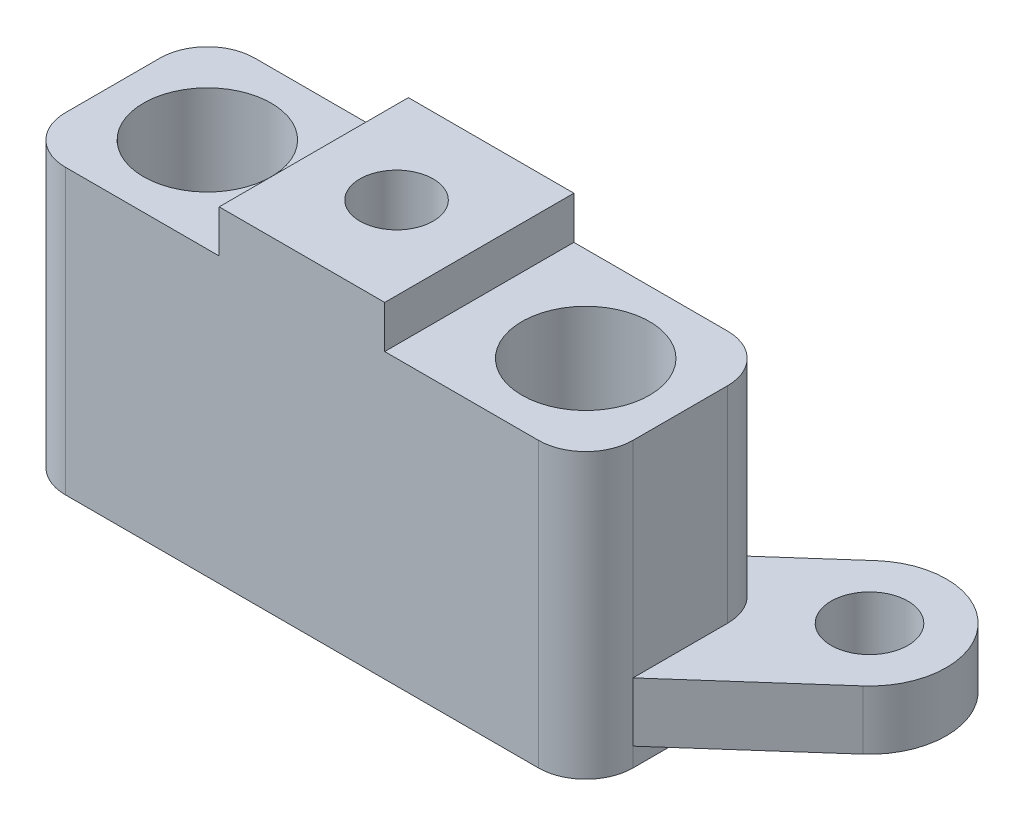
ISO-10303-21;
HEADER;
FILE_DESCRIPTION(('STEP AP214'),'2;1');
FILE_NAME('part.step','',(''),(''),'','','');
FILE_SCHEMA(('AUTOMOTIVE_DESIGN { 1 0 10303 214 1 1 1 1 }'));
ENDSEC;
DATA;
#1=APPLICATION_CONTEXT('core data for automotive mechanical design processes');
#2=APPLICATION_PROTOCOL_DEFINITION('international standard','automotive_design',2000,#1);
#3=PRODUCT_CONTEXT('',#1,'mechanical');
#4=PRODUCT('Part','Part','',(#3));
#5=PRODUCT_RELATED_PRODUCT_CATEGORY('part','',(#4));
#6=PRODUCT_DEFINITION_FORMATION('','',#4);
#7=PRODUCT_DEFINITION_CONTEXT('part definition',#1,'design');
#8=PRODUCT_DEFINITION('design','',#6,#7);
#9=PRODUCT_DEFINITION_SHAPE('','',#8);
#10=(LENGTH_UNIT() NAMED_UNIT(*) SI_UNIT(.MILLI.,.METRE.));
#11=(NAMED_UNIT(*) PLANE_ANGLE_UNIT() SI_UNIT($,.RADIAN.));
#12=(NAMED_UNIT(*) SI_UNIT($,.STERADIAN.) SOLID_ANGLE_UNIT());
#13=UNCERTAINTY_MEASURE_WITH_UNIT(LENGTH_MEASURE(1.E-05),#10,'distance_accuracy_value','');
#14=(GEOMETRIC_REPRESENTATION_CONTEXT(3) GLOBAL_UNCERTAINTY_ASSIGNED_CONTEXT((#13)) GLOBAL_UNIT_ASSIGNED_CONTEXT((#10,
#11,#12)) REPRESENTATION_CONTEXT('',''));
#15=CARTESIAN_POINT('',(0.,0.,0.));
#16=DIRECTION('',(0.,0.,1.));
#17=DIRECTION('',(1.,0.,0.));
#18=AXIS2_PLACEMENT_3D('',#15,#16,#17);
#19=CARTESIAN_POINT('',(12.,12.,-4.));
#20=DIRECTION('',(-1.,0.,0.));
#21=DIRECTION('',(0.,0.,1.));
#22=AXIS2_PLACEMENT_3D('',#19,#20,#21);
#23=PLANE('',#22);
#24=DIRECTION('',(0.,0.,-1.));
#25=VECTOR('',#24,1.);
#26=CARTESIAN_POINT('',(12.,0.8,-4.));
#27=LINE('',#26,#25);
#28=CARTESIAN_POINT('',(12.,0.8,1.99999999999999));
#29=VERTEX_POINT('',#28);
#30=CARTESIAN_POINT('',(12.,0.8,-2.));
#31=VERTEX_POINT('',#30);
#32=EDGE_CURVE('E237',#29,#31,#27,.T.);
#33=ORIENTED_EDGE('',*,*,#32,.F.);
#34=DIRECTION('',(0.,-1.,0.));
#35=VECTOR('',#34,1.);
#36=CARTESIAN_POINT('',(12.,12.,2.));
#37=LINE('',#36,#35);
#38=CARTESIAN_POINT('',(12.,0.,2.));
#39=VERTEX_POINT('',#38);
#40=EDGE_CURVE('E376',#29,#39,#37,.T.);
#41=ORIENTED_EDGE('',*,*,#40,.T.);
#42=DIRECTION('',(0.,0.,-1.));
#43=VECTOR('',#42,1.);
#44=CARTESIAN_POINT('',(12.,0.,-4.));
#45=LINE('',#44,#43);
#46=CARTESIAN_POINT('',(12.,0.,-2.));
#47=VERTEX_POINT('',#46);
#48=EDGE_CURVE('E310',#39,#47,#45,.T.);
#49=ORIENTED_EDGE('',*,*,#48,.T.);
#50=DIRECTION('',(0.,-1.,0.));
#51=VECTOR('',#50,1.);
#52=CARTESIAN_POINT('',(12.,12.,-2.));
#53=LINE('',#52,#51);
#54=EDGE_CURVE('E381',#47,#31,#53,.F.);
#55=ORIENTED_EDGE('',*,*,#54,.T.);
#56=EDGE_LOOP('',(#33,#41,#49,#55));
#57=FACE_BOUND('',#56,.T.);
#58=ADVANCED_FACE('F33',(#57),#23,.F.);
#59=CARTESIAN_POINT('',(9.99999999999999,13.8,-2.));
#60=DIRECTION('',(0.,-1.,0.));
#61=DIRECTION('',(0.,0.,-1.));
#62=AXIS2_PLACEMENT_3D('',#59,#60,#61);
#63=CYLINDRICAL_SURFACE('',#62,2.);
#64=DIRECTION('',(0.,-1.,0.));
#65=VECTOR('',#64,1.);
#66=CARTESIAN_POINT('',(9.99999999999999,13.8,-4.));
#67=LINE('',#66,#65);
#68=CARTESIAN_POINT('',(9.99999999999999,0.8,-4.));
#69=VERTEX_POINT('',#68);
#70=CARTESIAN_POINT('',(9.99999999999999,0.,-4.));
#71=VERTEX_POINT('',#70);
#72=EDGE_CURVE('E365',#69,#71,#67,.T.);
#73=ORIENTED_EDGE('',*,*,#72,.F.);
#74=CARTESIAN_POINT('',(9.99999999999999,0.8,-2.));
#75=DIRECTION('',(0.,1.,0.));
#76=DIRECTION('',(0.,0.,1.));
#77=AXIS2_PLACEMENT_3D('',#74,#75,#76);
#78=CIRCLE('',#77,2.);
#79=EDGE_CURVE('E233',#69,#31,#78,.F.);
#80=ORIENTED_EDGE('',*,*,#79,.T.);
#81=ORIENTED_EDGE('',*,*,#54,.F.);
#82=CARTESIAN_POINT('',(9.99999999999999,0.,-2.));
#83=DIRECTION('',(0.,1.,0.));
#84=DIRECTION('',(0.,0.,1.));
#85=AXIS2_PLACEMENT_3D('',#82,#83,#84);
#86=CIRCLE('',#85,2.);
#87=EDGE_CURVE('E374',#71,#47,#86,.F.);
#88=ORIENTED_EDGE('',*,*,#87,.F.);
#89=EDGE_LOOP('',(#73,#80,#81,#88));
#90=FACE_BOUND('',#89,.T.);
#91=ADVANCED_FACE('F433',(#90),#63,.T.);
#92=CARTESIAN_POINT('',(-3.5,13.8,-4.));
#93=DIRECTION('',(0.,0.,1.));
#94=DIRECTION('',(1.,0.,0.));
#95=AXIS2_PLACEMENT_3D('',#92,#93,#94);
#96=PLANE('',#95);
#97=CARTESIAN_POINT('',(9.99999999999999,12.,-4.));
#98=VERTEX_POINT('',#97);
#99=CARTESIAN_POINT('',(9.99999999999999,3.3,-4.));
#100=VERTEX_POINT('',#99);
#101=EDGE_CURVE('E366',#98,#100,#67,.T.);
#102=ORIENTED_EDGE('',*,*,#101,.T.);
#103=DIRECTION('',(-1.,0.,0.));
#104=VECTOR('',#103,1.);
#105=CARTESIAN_POINT('',(-3.5,3.3,-4.));
#106=LINE('',#105,#104);
#107=CARTESIAN_POINT('',(8.97041417674337,3.3,-4.));
#108=VERTEX_POINT('',#107);
#109=EDGE_CURVE('E48',#100,#108,#106,.T.);
#110=ORIENTED_EDGE('',*,*,#109,.T.);
#111=DIRECTION('',(0.,-1.,0.));
#112=VECTOR('',#111,1.);
#113=CARTESIAN_POINT('',(8.97041417674337,3.3,-4.));
#114=LINE('',#113,#112);
#115=CARTESIAN_POINT('',(8.97041417674337,0.8,-4.));
#116=VERTEX_POINT('',#115);
#117=EDGE_CURVE('E52',#108,#116,#114,.T.);
#118=ORIENTED_EDGE('',*,*,#117,.T.);
#119=DIRECTION('',(-1.,0.,0.));
#120=VECTOR('',#119,1.);
#121=CARTESIAN_POINT('',(-3.5,0.8,-4.));
#122=LINE('',#121,#120);
#123=EDGE_CURVE('E240',#69,#116,#122,.T.);
#124=ORIENTED_EDGE('',*,*,#123,.F.);
#125=ORIENTED_EDGE('',*,*,#72,.T.);
#126=DIRECTION('',(-1.,0.,0.));
#127=VECTOR('',#126,1.);
#128=CARTESIAN_POINT('',(-3.5,0.,-4.));
#129=LINE('',#128,#127);
#130=CARTESIAN_POINT('',(-10.,0.,-4.));
#131=VERTEX_POINT('',#130);
#132=EDGE_CURVE('E335',#71,#131,#129,.T.);
#133=ORIENTED_EDGE('',*,*,#132,.T.);
#134=DIRECTION('',(0.,-1.,0.));
#135=VECTOR('',#134,1.);
#136=CARTESIAN_POINT('',(-10.,13.8,-4.));
#137=LINE('',#136,#135);
#138=CARTESIAN_POINT('',(-10.,0.8,-4.));
#139=VERTEX_POINT('',#138);
#140=EDGE_CURVE('E362',#131,#139,#137,.F.);
#141=ORIENTED_EDGE('',*,*,#140,.T.);
#142=DIRECTION('',(1.,0.,0.));
#143=VECTOR('',#142,1.);
#144=CARTESIAN_POINT('',(-3.5,0.8,-4.));
#145=LINE('',#144,#143);
#146=CARTESIAN_POINT('',(-8.97041417674337,0.8,-4.));
#147=VERTEX_POINT('',#146);
#148=EDGE_CURVE('E284',#139,#147,#145,.T.);
#149=ORIENTED_EDGE('',*,*,#148,.T.);
#150=DIRECTION('',(0.,-1.,0.));
#151=VECTOR('',#150,1.);
#152=CARTESIAN_POINT('',(-8.97041417674337,3.3,-4.));
#153=LINE('',#152,#151);
#154=CARTESIAN_POINT('',(-8.97041417674337,3.3,-4.));
#155=VERTEX_POINT('',#154);
#156=EDGE_CURVE('E276',#155,#147,#153,.T.);
#157=ORIENTED_EDGE('',*,*,#156,.F.);
#158=DIRECTION('',(1.,0.,0.));
#159=VECTOR('',#158,1.);
#160=CARTESIAN_POINT('',(-3.5,3.3,-4.));
#161=LINE('',#160,#159);
#162=CARTESIAN_POINT('',(-10.,3.3,-4.));
#163=VERTEX_POINT('',#162);
#164=EDGE_CURVE('E291',#163,#155,#161,.T.);
#165=ORIENTED_EDGE('',*,*,#164,.F.);
#166=CARTESIAN_POINT('',(-10.,12.,-4.));
#167=VERTEX_POINT('',#166);
#168=EDGE_CURVE('E361',#163,#167,#137,.F.);
#169=ORIENTED_EDGE('',*,*,#168,.T.);
#170=DIRECTION('',(-1.,0.,0.));
#171=VECTOR('',#170,1.);
#172=CARTESIAN_POINT('',(12.,12.,-4.));
#173=LINE('',#172,#171);
#174=CARTESIAN_POINT('',(-3.5,12.,-4.));
#175=VERTEX_POINT('',#174);
#176=EDGE_CURVE('E316',#175,#167,#173,.T.);
#177=ORIENTED_EDGE('',*,*,#176,.F.);
#178=DIRECTION('',(0.,-1.,0.));
#179=VECTOR('',#178,1.);
#180=CARTESIAN_POINT('',(-3.5,13.8,-4.));
#181=LINE('',#180,#179);
#182=CARTESIAN_POINT('',(-3.5,13.8,-4.));
#183=VERTEX_POINT('',#182);
#184=EDGE_CURVE('E355',#183,#175,#181,.T.);
#185=ORIENTED_EDGE('',*,*,#184,.F.);
#186=DIRECTION('',(-1.,0.,0.));
#187=VECTOR('',#186,1.);
#188=CARTESIAN_POINT('',(-3.5,13.8,-4.));
#189=LINE('',#188,#187);
#190=CARTESIAN_POINT('',(3.5,13.8,-4.));
#191=VERTEX_POINT('',#190);
#192=EDGE_CURVE('E339',#191,#183,#189,.T.);
#193=ORIENTED_EDGE('',*,*,#192,.F.);
#194=DIRECTION('',(0.,-1.,0.));
#195=VECTOR('',#194,1.);
#196=CARTESIAN_POINT('',(3.5,13.8,-4.));
#197=LINE('',#196,#195);
#198=CARTESIAN_POINT('',(3.5,12.,-4.));
#199=VERTEX_POINT('',#198);
#200=EDGE_CURVE('E358',#191,#199,#197,.T.);
#201=ORIENTED_EDGE('',*,*,#200,.T.);
#202=EDGE_CURVE('E318',#98,#199,#173,.T.);
#203=ORIENTED_EDGE('',*,*,#202,.F.);
#204=EDGE_LOOP('',(#102,#110,#118,#124,#125,#133,#141,#149,#157,#165,#169,#177,#185,#193,#201,#203));
#205=FACE_BOUND('',#204,.T.);
#206=ADVANCED_FACE('F423',(#205),#96,.F.);
#207=CARTESIAN_POINT('',(-12.,12.,-4.));
#208=DIRECTION('',(1.,0.,0.));
#209=DIRECTION('',(0.,0.,-1.));
#210=AXIS2_PLACEMENT_3D('',#207,#208,#209);
#211=PLANE('',#210);
#212=DIRECTION('',(0.,0.,-1.));
#213=VECTOR('',#212,1.);
#214=CARTESIAN_POINT('',(-12.,3.3,-4.));
#215=LINE('',#214,#213);
#216=CARTESIAN_POINT('',(-12.,3.3,1.99999999999999));
#217=VERTEX_POINT('',#216);
#218=CARTESIAN_POINT('',(-12.,3.3,-2.));
#219=VERTEX_POINT('',#218);
#220=EDGE_CURVE('E288',#217,#219,#215,.T.);
#221=ORIENTED_EDGE('',*,*,#220,.F.);
#222=DIRECTION('',(0.,-1.,0.));
#223=VECTOR('',#222,1.);
#224=CARTESIAN_POINT('',(-12.,12.,2.));
#225=LINE('',#224,#223);
#226=CARTESIAN_POINT('',(-12.,12.,2.));
#227=VERTEX_POINT('',#226);
#228=EDGE_CURVE('E388',#217,#227,#225,.F.);
#229=ORIENTED_EDGE('',*,*,#228,.T.);
#230=DIRECTION('',(0.,0.,1.));
#231=VECTOR('',#230,1.);
#232=CARTESIAN_POINT('',(-12.,12.,-4.));
#233=LINE('',#232,#231);
#234=CARTESIAN_POINT('',(-12.,12.,-2.));
#235=VERTEX_POINT('',#234);
#236=EDGE_CURVE('E320',#235,#227,#233,.T.);
#237=ORIENTED_EDGE('',*,*,#236,.F.);
#238=DIRECTION('',(0.,-1.,0.));
#239=VECTOR('',#238,1.);
#240=CARTESIAN_POINT('',(-12.,12.,-2.));
#241=LINE('',#240,#239);
#242=EDGE_CURVE('E393',#235,#219,#241,.T.);
#243=ORIENTED_EDGE('',*,*,#242,.T.);
#244=EDGE_LOOP('',(#221,#229,#237,#243));
#245=FACE_BOUND('',#244,.T.);
#246=ADVANCED_FACE('F468',(#245),#211,.F.);
#247=CARTESIAN_POINT('',(-10.,12.,-2.));
#248=DIRECTION('',(0.,-1.,0.));
#249=DIRECTION('',(0.,0.,-1.));
#250=AXIS2_PLACEMENT_3D('',#247,#248,#249);
#251=CYLINDRICAL_SURFACE('',#250,2.);
#252=ORIENTED_EDGE('',*,*,#168,.F.);
#253=CARTESIAN_POINT('',(-10.,3.3,-2.));
#254=DIRECTION('',(0.,-1.,0.));
#255=DIRECTION('',(0.,0.,-1.));
#256=AXIS2_PLACEMENT_3D('',#253,#254,#255);
#257=CIRCLE('',#256,2.);
#258=EDGE_CURVE('E286',#163,#219,#257,.F.);
#259=ORIENTED_EDGE('',*,*,#258,.T.);
#260=ORIENTED_EDGE('',*,*,#242,.F.);
#261=CARTESIAN_POINT('',(-10.,12.,-2.));
#262=DIRECTION('',(0.,-1.,0.));
#263=DIRECTION('',(0.,0.,-1.));
#264=AXIS2_PLACEMENT_3D('',#261,#262,#263);
#265=CIRCLE('',#264,2.);
#266=EDGE_CURVE('E398',#167,#235,#265,.F.);
#267=ORIENTED_EDGE('',*,*,#266,.F.);
#268=EDGE_LOOP('',(#252,#259,#260,#267));
#269=FACE_BOUND('',#268,.T.);
#270=ADVANCED_FACE('F474',(#269),#251,.T.);
#271=CARTESIAN_POINT('',(3.5,13.8,-4.));
#272=DIRECTION('',(-1.,0.,0.));
#273=DIRECTION('',(0.,0.,1.));
#274=AXIS2_PLACEMENT_3D('',#271,#272,#273);
#275=PLANE('',#274);
#276=DIRECTION('',(0.,0.,1.));
#277=VECTOR('',#276,1.);
#278=CARTESIAN_POINT('',(3.5,12.,-4.));
#279=LINE('',#278,#277);
#280=CARTESIAN_POINT('',(3.5,12.,4.));
#281=VERTEX_POINT('',#280);
#282=EDGE_CURVE('E332',#199,#281,#279,.T.);
#283=ORIENTED_EDGE('',*,*,#282,.F.);
#284=ORIENTED_EDGE('',*,*,#200,.F.);
#285=DIRECTION('',(0.,0.,-1.));
#286=VECTOR('',#285,1.);
#287=CARTESIAN_POINT('',(3.5,13.8,-4.));
#288=LINE('',#287,#286);
#289=CARTESIAN_POINT('',(3.5,13.8,4.));
#290=VERTEX_POINT('',#289);
#291=EDGE_CURVE('E336',#290,#191,#288,.T.);
#292=ORIENTED_EDGE('',*,*,#291,.F.);
#293=DIRECTION('',(0.,-1.,0.));
#294=VECTOR('',#293,1.);
#295=CARTESIAN_POINT('',(3.5,13.8,4.));
#296=LINE('',#295,#294);
#297=EDGE_CURVE('E346',#290,#281,#296,.T.);
#298=ORIENTED_EDGE('',*,*,#297,.T.);
#299=EDGE_LOOP('',(#283,#284,#292,#298));
#300=FACE_BOUND('',#299,.T.);
#301=ADVANCED_FACE('F492',(#300),#275,.F.);
#302=CARTESIAN_POINT('',(-3.5,13.8,-4.));
#303=DIRECTION('',(1.,0.,0.));
#304=DIRECTION('',(0.,0.,-1.));
#305=AXIS2_PLACEMENT_3D('',#302,#303,#304);
#306=PLANE('',#305);
#307=DIRECTION('',(0.,0.,-1.));
#308=VECTOR('',#307,1.);
#309=CARTESIAN_POINT('',(-3.5,12.,-4.));
#310=LINE('',#309,#308);
#311=CARTESIAN_POINT('',(-3.5,12.,4.));
#312=VERTEX_POINT('',#311);
#313=EDGE_CURVE('E326',#312,#175,#310,.T.);
#314=ORIENTED_EDGE('',*,*,#313,.F.);
#315=DIRECTION('',(0.,-1.,0.));
#316=VECTOR('',#315,1.);
#317=CARTESIAN_POINT('',(-3.5,13.8,4.));
#318=LINE('',#317,#316);
#319=CARTESIAN_POINT('',(-3.5,13.8,4.));
#320=VERTEX_POINT('',#319);
#321=EDGE_CURVE('E352',#320,#312,#318,.T.);
#322=ORIENTED_EDGE('',*,*,#321,.F.);
#323=DIRECTION('',(0.,0.,1.));
#324=VECTOR('',#323,1.);
#325=CARTESIAN_POINT('',(-3.5,13.8,-4.));
#326=LINE('',#325,#324);
#327=EDGE_CURVE('E342',#183,#320,#326,.T.);
#328=ORIENTED_EDGE('',*,*,#327,.F.);
#329=ORIENTED_EDGE('',*,*,#184,.T.);
#330=EDGE_LOOP('',(#314,#322,#328,#329));
#331=FACE_BOUND('',#330,.T.);
#332=ADVANCED_FACE('F483',(#331),#306,.F.);
#333=CARTESIAN_POINT('',(-3.5,13.8,4.));
#334=DIRECTION('',(0.,0.,-1.));
#335=DIRECTION('',(-1.,0.,0.));
#336=AXIS2_PLACEMENT_3D('',#333,#334,#335);
#337=PLANE('',#336);
#338=DIRECTION('',(1.,0.,0.));
#339=VECTOR('',#338,1.);
#340=CARTESIAN_POINT('',(12.,12.,4.));
#341=LINE('',#340,#339);
#342=CARTESIAN_POINT('',(-10.,12.,4.));
#343=VERTEX_POINT('',#342);
#344=EDGE_CURVE('E324',#343,#312,#341,.T.);
#345=ORIENTED_EDGE('',*,*,#344,.F.);
#346=DIRECTION('',(0.,-1.,0.));
#347=VECTOR('',#346,1.);
#348=CARTESIAN_POINT('',(-10.,13.8,4.));
#349=LINE('',#348,#347);
#350=CARTESIAN_POINT('',(-10.,0.,4.));
#351=VERTEX_POINT('',#350);
#352=EDGE_CURVE('E11',#343,#351,#349,.T.);
#353=ORIENTED_EDGE('',*,*,#352,.T.);
#354=DIRECTION('',(1.,0.,0.));
#355=VECTOR('',#354,1.);
#356=CARTESIAN_POINT('',(-3.5,0.,4.));
#357=LINE('',#356,#355);
#358=CARTESIAN_POINT('',(9.99999999999999,0.,4.));
#359=VERTEX_POINT('',#358);
#360=EDGE_CURVE('E340',#351,#359,#357,.T.);
#361=ORIENTED_EDGE('',*,*,#360,.T.);
#362=DIRECTION('',(0.,-1.,0.));
#363=VECTOR('',#362,1.);
#364=CARTESIAN_POINT('',(9.99999999999999,13.8,4.));
#365=LINE('',#364,#363);
#366=CARTESIAN_POINT('',(9.99999999999999,12.,4.));
#367=VERTEX_POINT('',#366);
#368=EDGE_CURVE('E41',#359,#367,#365,.F.);
#369=ORIENTED_EDGE('',*,*,#368,.T.);
#370=EDGE_CURVE('E323',#281,#367,#341,.T.);
#371=ORIENTED_EDGE('',*,*,#370,.F.);
#372=ORIENTED_EDGE('',*,*,#297,.F.);
#373=DIRECTION('',(1.,0.,0.));
#374=VECTOR('',#373,1.);
#375=CARTESIAN_POINT('',(-3.5,13.8,4.));
#376=LINE('',#375,#374);
#377=EDGE_CURVE('E344',#320,#290,#376,.T.);
#378=ORIENTED_EDGE('',*,*,#377,.F.);
#379=ORIENTED_EDGE('',*,*,#321,.T.);
#380=EDGE_LOOP('',(#345,#353,#361,#369,#371,#372,#378,#379));
#381=FACE_BOUND('',#380,.T.);
#382=ADVANCED_FACE('F404',(#381),#337,.F.);
#383=CARTESIAN_POINT('',(0.,13.8,0.));
#384=DIRECTION('',(0.,1.,0.));
#385=DIRECTION('',(0.,0.,1.));
#386=AXIS2_PLACEMENT_3D('',#383,#384,#385);
#387=PLANE('',#386);
#388=CARTESIAN_POINT('',(0.,13.8,0.));
#389=DIRECTION('',(0.,1.,0.));
#390=DIRECTION('',(0.,0.,1.));
#391=AXIS2_PLACEMENT_3D('',#388,#389,#390);
#392=CIRCLE('',#391,1.55);
#393=CARTESIAN_POINT('',(0.,13.8,1.55));
#394=VERTEX_POINT('',#393);
#395=EDGE_CURVE('E294',#394,#394,#392,.T.);
#396=ORIENTED_EDGE('',*,*,#395,.F.);
#397=EDGE_LOOP('',(#396));
#398=FACE_BOUND('',#397,.T.);
#399=ORIENTED_EDGE('',*,*,#291,.T.);
#400=ORIENTED_EDGE('',*,*,#192,.T.);
#401=ORIENTED_EDGE('',*,*,#327,.T.);
#402=ORIENTED_EDGE('',*,*,#377,.T.);
#403=EDGE_LOOP('',(#399,#400,#401,#402));
#404=FACE_BOUND('',#403,.T.);
#405=ADVANCED_FACE('F489',(#398,#404),#387,.T.);
#406=CARTESIAN_POINT('',(0.,0.,0.));
#407=DIRECTION('',(0.,1.,0.));
#408=DIRECTION('',(0.,0.,1.));
#409=AXIS2_PLACEMENT_3D('',#406,#407,#408);
#410=PLANE('',#409);
#411=ORIENTED_EDGE('',*,*,#132,.F.);
#412=ORIENTED_EDGE('',*,*,#87,.T.);
#413=ORIENTED_EDGE('',*,*,#48,.F.);
#414=CARTESIAN_POINT('',(9.99999999999999,0.,2.));
#415=DIRECTION('',(0.,1.,0.));
#416=DIRECTION('',(0.,0.,1.));
#417=AXIS2_PLACEMENT_3D('',#414,#415,#416);
#418=CIRCLE('',#417,2.);
#419=EDGE_CURVE('E368',#39,#359,#418,.F.);
#420=ORIENTED_EDGE('',*,*,#419,.T.);
#421=ORIENTED_EDGE('',*,*,#360,.F.);
#422=CARTESIAN_POINT('',(-10.,0.,2.));
#423=DIRECTION('',(0.,1.,0.));
#424=DIRECTION('',(0.,0.,1.));
#425=AXIS2_PLACEMENT_3D('',#422,#423,#424);
#426=CIRCLE('',#425,2.);
#427=CARTESIAN_POINT('',(-12.,0.,2.));
#428=VERTEX_POINT('',#427);
#429=EDGE_CURVE('E370',#351,#428,#426,.F.);
#430=ORIENTED_EDGE('',*,*,#429,.T.);
#431=DIRECTION('',(0.,0.,1.));
#432=VECTOR('',#431,1.);
#433=CARTESIAN_POINT('',(-12.,0.,-4.));
#434=LINE('',#433,#432);
#435=CARTESIAN_POINT('',(-12.,0.,-2.));
#436=VERTEX_POINT('',#435);
#437=EDGE_CURVE('E317',#436,#428,#434,.T.);
#438=ORIENTED_EDGE('',*,*,#437,.F.);
#439=CARTESIAN_POINT('',(-10.,0.,-2.));
#440=DIRECTION('',(0.,1.,0.));
#441=DIRECTION('',(0.,0.,1.));
#442=AXIS2_PLACEMENT_3D('',#439,#440,#441);
#443=CIRCLE('',#442,2.);
#444=EDGE_CURVE('E372',#436,#131,#443,.F.);
#445=ORIENTED_EDGE('',*,*,#444,.T.);
#446=EDGE_LOOP('',(#411,#412,#413,#420,#421,#430,#438,#445));
#447=FACE_BOUND('',#446,.T.);
#448=CARTESIAN_POINT('',(-8.00000000000001,0.,0.));
#449=DIRECTION('',(0.,1.,0.));
#450=DIRECTION('',(0.,0.,1.));
#451=AXIS2_PLACEMENT_3D('',#448,#449,#450);
#452=CIRCLE('',#451,2.7);
#453=CARTESIAN_POINT('',(-8.00000000000001,0.,2.7));
#454=VERTEX_POINT('',#453);
#455=EDGE_CURVE('E298',#454,#454,#452,.T.);
#456=ORIENTED_EDGE('',*,*,#455,.T.);
#457=EDGE_LOOP('',(#456));
#458=FACE_BOUND('',#457,.T.);
#459=CARTESIAN_POINT('',(7.99999999999999,0.,0.));
#460=DIRECTION('',(0.,1.,0.));
#461=DIRECTION('',(0.,0.,1.));
#462=AXIS2_PLACEMENT_3D('',#459,#460,#461);
#463=CIRCLE('',#462,2.7);
#464=CARTESIAN_POINT('',(7.99999999999999,0.,2.7));
#465=VERTEX_POINT('',#464);
#466=EDGE_CURVE('E304',#465,#465,#463,.T.);
#467=ORIENTED_EDGE('',*,*,#466,.T.);
#468=EDGE_LOOP('',(#467));
#469=FACE_BOUND('',#468,.T.);
#470=ADVANCED_FACE('F438',(#447,#458,#469),#410,.F.);
#471=CARTESIAN_POINT('',(-8.00000000000001,12.,0.));
#472=DIRECTION('',(0.,-1.,0.));
#473=DIRECTION('',(0.,0.,-1.));
#474=AXIS2_PLACEMENT_3D('',#471,#472,#473);
#475=CYLINDRICAL_SURFACE('',#474,2.7);
#476=CARTESIAN_POINT('',(-8.00000000000001,12.,0.));
#477=DIRECTION('',(0.,1.,0.));
#478=DIRECTION('',(0.,0.,1.));
#479=AXIS2_PLACEMENT_3D('',#476,#477,#478);
#480=CIRCLE('',#479,2.7);
#481=CARTESIAN_POINT('',(-8.00000000000001,12.,2.7));
#482=VERTEX_POINT('',#481);
#483=EDGE_CURVE('E301',#482,#482,#480,.T.);
#484=ORIENTED_EDGE('',*,*,#483,.T.);
#485=EDGE_LOOP('',(#484));
#486=FACE_BOUND('',#485,.T.);
#487=ORIENTED_EDGE('',*,*,#455,.F.);
#488=EDGE_LOOP('',(#487));
#489=FACE_BOUND('',#488,.T.);
#490=ADVANCED_FACE('F530',(#486,#489),#475,.F.);
#491=CARTESIAN_POINT('',(-12.,0.8,2.));
#492=VERTEX_POINT('',#491);
#493=EDGE_CURVE('E389',#428,#492,#225,.F.);
#494=ORIENTED_EDGE('',*,*,#493,.T.);
#495=DIRECTION('',(0.,0.,-1.));
#496=VECTOR('',#495,1.);
#497=CARTESIAN_POINT('',(-12.,0.8,-4.));
#498=LINE('',#497,#496);
#499=CARTESIAN_POINT('',(-12.,0.8,-2.));
#500=VERTEX_POINT('',#499);
#501=EDGE_CURVE('E282',#492,#500,#498,.T.);
#502=ORIENTED_EDGE('',*,*,#501,.T.);
#503=EDGE_CURVE('E392',#500,#436,#241,.T.);
#504=ORIENTED_EDGE('',*,*,#503,.T.);
#505=ORIENTED_EDGE('',*,*,#437,.T.);
#506=EDGE_LOOP('',(#494,#502,#504,#505));
#507=FACE_BOUND('',#506,.T.);
#508=ADVANCED_FACE('F525',(#507),#211,.F.);
#509=CARTESIAN_POINT('',(0.,12.,0.));
#510=DIRECTION('',(0.,-1.,0.));
#511=DIRECTION('',(0.,0.,-1.));
#512=AXIS2_PLACEMENT_3D('',#509,#510,#511);
#513=PLANE('',#512);
#514=ORIENTED_EDGE('',*,*,#483,.F.);
#515=EDGE_LOOP('',(#514));
#516=FACE_BOUND('',#515,.T.);
#517=ORIENTED_EDGE('',*,*,#176,.T.);
#518=ORIENTED_EDGE('',*,*,#266,.T.);
#519=ORIENTED_EDGE('',*,*,#236,.T.);
#520=CARTESIAN_POINT('',(-10.,12.,2.));
#521=DIRECTION('',(0.,-1.,0.));
#522=DIRECTION('',(0.,0.,-1.));
#523=AXIS2_PLACEMENT_3D('',#520,#521,#522);
#524=CIRCLE('',#523,2.);
#525=EDGE_CURVE('E396',#227,#343,#524,.F.);
#526=ORIENTED_EDGE('',*,*,#525,.T.);
#527=ORIENTED_EDGE('',*,*,#344,.T.);
#528=ORIENTED_EDGE('',*,*,#313,.T.);
#529=EDGE_LOOP('',(#517,#518,#519,#526,#527,#528));
#530=FACE_BOUND('',#529,.T.);
#531=ADVANCED_FACE('F479',(#516,#530),#513,.F.);
#532=CARTESIAN_POINT('',(7.99999999999999,12.,0.));
#533=DIRECTION('',(0.,1.,0.));
#534=DIRECTION('',(0.,0.,1.));
#535=AXIS2_PLACEMENT_3D('',#532,#533,#534);
#536=CIRCLE('',#535,2.7);
#537=CARTESIAN_POINT('',(7.99999999999999,12.,2.7));
#538=VERTEX_POINT('',#537);
#539=EDGE_CURVE('E307',#538,#538,#536,.T.);
#540=ORIENTED_EDGE('',*,*,#539,.F.);
#541=EDGE_LOOP('',(#540));
#542=FACE_BOUND('',#541,.T.);
#543=DIRECTION('',(0.,0.,-1.));
#544=VECTOR('',#543,1.);
#545=CARTESIAN_POINT('',(12.,12.,-4.));
#546=LINE('',#545,#544);
#547=CARTESIAN_POINT('',(12.,12.,2.));
#548=VERTEX_POINT('',#547);
#549=CARTESIAN_POINT('',(12.,12.,-2.));
#550=VERTEX_POINT('',#549);
#551=EDGE_CURVE('E313',#548,#550,#546,.T.);
#552=ORIENTED_EDGE('',*,*,#551,.T.);
#553=CARTESIAN_POINT('',(9.99999999999999,12.,-2.));
#554=DIRECTION('',(0.,-1.,0.));
#555=DIRECTION('',(0.,0.,-1.));
#556=AXIS2_PLACEMENT_3D('',#553,#554,#555);
#557=CIRCLE('',#556,2.);
#558=EDGE_CURVE('E386',#550,#98,#557,.F.);
#559=ORIENTED_EDGE('',*,*,#558,.T.);
#560=ORIENTED_EDGE('',*,*,#202,.T.);
#561=ORIENTED_EDGE('',*,*,#282,.T.);
#562=ORIENTED_EDGE('',*,*,#370,.T.);
#563=CARTESIAN_POINT('',(9.99999999999999,12.,2.));
#564=DIRECTION('',(0.,-1.,0.));
#565=DIRECTION('',(0.,0.,-1.));
#566=AXIS2_PLACEMENT_3D('',#563,#564,#565);
#567=CIRCLE('',#566,2.);
#568=EDGE_CURVE('E384',#367,#548,#567,.F.);
#569=ORIENTED_EDGE('',*,*,#568,.T.);
#570=EDGE_LOOP('',(#552,#559,#560,#561,#562,#569));
#571=FACE_BOUND('',#570,.T.);
#572=ADVANCED_FACE('F411',(#542,#571),#513,.F.);
#573=CARTESIAN_POINT('',(12.,3.3,2.));
#574=VERTEX_POINT('',#573);
#575=EDGE_CURVE('E377',#548,#574,#37,.T.);
#576=ORIENTED_EDGE('',*,*,#575,.T.);
#577=DIRECTION('',(0.,0.,-1.));
#578=VECTOR('',#577,1.);
#579=CARTESIAN_POINT('',(12.,3.3,-4.));
#580=LINE('',#579,#578);
#581=CARTESIAN_POINT('',(12.,3.3,-2.));
#582=VERTEX_POINT('',#581);
#583=EDGE_CURVE('E215',#574,#582,#580,.T.);
#584=ORIENTED_EDGE('',*,*,#583,.T.);
#585=EDGE_CURVE('E380',#582,#550,#53,.F.);
#586=ORIENTED_EDGE('',*,*,#585,.T.);
#587=ORIENTED_EDGE('',*,*,#551,.F.);
#588=EDGE_LOOP('',(#576,#584,#586,#587));
#589=FACE_BOUND('',#588,.T.);
#590=ADVANCED_FACE('F416',(#589),#23,.F.);
#591=CARTESIAN_POINT('',(7.99999999999999,12.,0.));
#592=DIRECTION('',(0.,-1.,0.));
#593=DIRECTION('',(0.,0.,-1.));
#594=AXIS2_PLACEMENT_3D('',#591,#592,#593);
#595=CYLINDRICAL_SURFACE('',#594,2.7);
#596=ORIENTED_EDGE('',*,*,#539,.T.);
#597=EDGE_LOOP('',(#596));
#598=FACE_BOUND('',#597,.T.);
#599=ORIENTED_EDGE('',*,*,#466,.F.);
#600=EDGE_LOOP('',(#599));
#601=FACE_BOUND('',#600,.T.);
#602=ADVANCED_FACE('F513',(#598,#601),#595,.F.);
#603=CARTESIAN_POINT('',(9.99999999999999,3.3,-2.));
#604=DIRECTION('',(0.,1.,0.));
#605=DIRECTION('',(0.,0.,1.));
#606=AXIS2_PLACEMENT_3D('',#603,#604,#605);
#607=CIRCLE('',#606,2.);
#608=EDGE_CURVE('E242',#100,#582,#607,.F.);
#609=ORIENTED_EDGE('',*,*,#608,.F.);
#610=ORIENTED_EDGE('',*,*,#101,.F.);
#611=ORIENTED_EDGE('',*,*,#558,.F.);
#612=ORIENTED_EDGE('',*,*,#585,.F.);
#613=EDGE_LOOP('',(#609,#610,#611,#612));
#614=FACE_BOUND('',#613,.T.);
#615=ADVANCED_FACE('F422',(#614),#63,.T.);
#616=CARTESIAN_POINT('',(-10.,0.8,-2.));
#617=DIRECTION('',(0.,-1.,0.));
#618=DIRECTION('',(0.,0.,-1.));
#619=AXIS2_PLACEMENT_3D('',#616,#617,#618);
#620=CIRCLE('',#619,2.);
#621=EDGE_CURVE('E273',#139,#500,#620,.F.);
#622=ORIENTED_EDGE('',*,*,#621,.F.);
#623=ORIENTED_EDGE('',*,*,#140,.F.);
#624=ORIENTED_EDGE('',*,*,#444,.F.);
#625=ORIENTED_EDGE('',*,*,#503,.F.);
#626=EDGE_LOOP('',(#622,#623,#624,#625));
#627=FACE_BOUND('',#626,.T.);
#628=ADVANCED_FACE('F445',(#627),#251,.T.);
#629=CARTESIAN_POINT('',(-10.,13.8,2.));
#630=DIRECTION('',(0.,-1.,0.));
#631=DIRECTION('',(0.,0.,-1.));
#632=AXIS2_PLACEMENT_3D('',#629,#630,#631);
#633=CYLINDRICAL_SURFACE('',#632,2.);
#634=ORIENTED_EDGE('',*,*,#525,.F.);
#635=ORIENTED_EDGE('',*,*,#228,.F.);
#636=DIRECTION('',(0.,-1.,0.));
#637=VECTOR('',#636,1.);
#638=CARTESIAN_POINT('',(-12.,3.3,1.99999999999999));
#639=LINE('',#638,#637);
#640=EDGE_CURVE('E274',#217,#492,#639,.T.);
#641=ORIENTED_EDGE('',*,*,#640,.T.);
#642=ORIENTED_EDGE('',*,*,#493,.F.);
#643=ORIENTED_EDGE('',*,*,#429,.F.);
#644=ORIENTED_EDGE('',*,*,#352,.F.);
#645=EDGE_LOOP('',(#634,#635,#641,#642,#643,#644));
#646=FACE_BOUND('',#645,.T.);
#647=ADVANCED_FACE('F563',(#646),#633,.T.);
#648=CARTESIAN_POINT('',(9.99999999999999,12.,2.));
#649=DIRECTION('',(0.,-1.,0.));
#650=DIRECTION('',(0.,0.,-1.));
#651=AXIS2_PLACEMENT_3D('',#648,#649,#650);
#652=CYLINDRICAL_SURFACE('',#651,2.);
#653=ORIENTED_EDGE('',*,*,#568,.F.);
#654=ORIENTED_EDGE('',*,*,#368,.F.);
#655=ORIENTED_EDGE('',*,*,#419,.F.);
#656=ORIENTED_EDGE('',*,*,#40,.F.);
#657=DIRECTION('',(0.,-1.,0.));
#658=VECTOR('',#657,1.);
#659=CARTESIAN_POINT('',(12.,3.3,1.99999999999999));
#660=LINE('',#659,#658);
#661=EDGE_CURVE('E204',#574,#29,#660,.T.);
#662=ORIENTED_EDGE('',*,*,#661,.F.);
#663=ORIENTED_EDGE('',*,*,#575,.F.);
#664=EDGE_LOOP('',(#653,#654,#655,#656,#662,#663));
#665=FACE_BOUND('',#664,.T.);
#666=ADVANCED_FACE('F35',(#665),#652,.T.);
#667=CARTESIAN_POINT('',(0.,7.3,0.));
#668=DIRECTION('',(0.,1.,0.));
#669=DIRECTION('',(0.,0.,1.));
#670=AXIS2_PLACEMENT_3D('',#667,#668,#669);
#671=CYLINDRICAL_SURFACE('',#670,1.55);
#672=CARTESIAN_POINT('',(0.,7.3,0.));
#673=DIRECTION('',(0.,1.,0.));
#674=DIRECTION('',(0.,0.,1.));
#675=AXIS2_PLACEMENT_3D('',#672,#673,#674);
#676=CIRCLE('',#675,1.55);
#677=CARTESIAN_POINT('',(0.,7.3,1.55));
#678=VERTEX_POINT('',#677);
#679=EDGE_CURVE('E295',#678,#678,#676,.T.);
#680=CARTESIAN_POINT('',(0.,7.3,1.55));
#681=CARTESIAN_POINT('',(0.,7.36770833333333,1.55));
#682=CARTESIAN_POINT('',(0.,7.43541666666667,1.55));
#683=CARTESIAN_POINT('',(0.,7.57083333333333,1.55));
#684=CARTESIAN_POINT('',(0.,7.63854166666667,1.55));
#685=CARTESIAN_POINT('',(0.,7.77395833333333,1.55));
#686=CARTESIAN_POINT('',(0.,7.84166666666667,1.55));
#687=CARTESIAN_POINT('',(0.,7.97708333333333,1.55));
#688=CARTESIAN_POINT('',(0.,8.04479166666667,1.55));
#689=CARTESIAN_POINT('',(0.,8.18020833333333,1.55));
#690=CARTESIAN_POINT('',(0.,8.24791666666667,1.55));
#691=CARTESIAN_POINT('',(0.,8.38333333333333,1.55));
#692=CARTESIAN_POINT('',(0.,8.45104166666667,1.55));
#693=CARTESIAN_POINT('',(0.,8.58645833333333,1.55));
#694=CARTESIAN_POINT('',(0.,8.65416666666667,1.55));
#695=CARTESIAN_POINT('',(0.,8.78958333333333,1.55));
#696=CARTESIAN_POINT('',(0.,8.85729166666667,1.55));
#697=CARTESIAN_POINT('',(0.,8.99270833333333,1.55));
#698=CARTESIAN_POINT('',(0.,9.06041666666667,1.55));
#699=CARTESIAN_POINT('',(0.,9.19583333333333,1.55));
#700=CARTESIAN_POINT('',(0.,9.26354166666667,1.55));
#701=CARTESIAN_POINT('',(0.,9.39895833333333,1.55));
#702=CARTESIAN_POINT('',(0.,9.46666666666667,1.55));
#703=CARTESIAN_POINT('',(0.,9.60208333333333,1.55));
#704=CARTESIAN_POINT('',(0.,9.66979166666667,1.55));
#705=CARTESIAN_POINT('',(0.,9.80520833333333,1.55));
#706=CARTESIAN_POINT('',(0.,9.87291666666667,1.55));
#707=CARTESIAN_POINT('',(0.,10.0083333333333,1.55));
#708=CARTESIAN_POINT('',(0.,10.0760416666667,1.55));
#709=CARTESIAN_POINT('',(0.,10.2114583333333,1.55));
#710=CARTESIAN_POINT('',(0.,10.2791666666667,1.55));
#711=CARTESIAN_POINT('',(0.,10.4145833333333,1.55));
#712=CARTESIAN_POINT('',(0.,10.4822916666667,1.55));
#713=CARTESIAN_POINT('',(0.,10.6177083333333,1.55));
#714=CARTESIAN_POINT('',(0.,10.6854166666667,1.55));
#715=CARTESIAN_POINT('',(0.,10.8208333333333,1.55));
#716=CARTESIAN_POINT('',(0.,10.8885416666667,1.55));
#717=CARTESIAN_POINT('',(0.,11.0239583333333,1.55));
#718=CARTESIAN_POINT('',(0.,11.0916666666667,1.55));
#719=CARTESIAN_POINT('',(0.,11.2270833333333,1.55));
#720=CARTESIAN_POINT('',(0.,11.2947916666667,1.55));
#721=CARTESIAN_POINT('',(0.,11.4302083333333,1.55));
#722=CARTESIAN_POINT('',(0.,11.4979166666667,1.55));
#723=CARTESIAN_POINT('',(0.,11.6333333333333,1.55));
#724=CARTESIAN_POINT('',(0.,11.7010416666667,1.55));
#725=CARTESIAN_POINT('',(0.,11.8364583333333,1.55));
#726=CARTESIAN_POINT('',(0.,11.9041666666667,1.55));
#727=CARTESIAN_POINT('',(0.,12.0395833333333,1.55));
#728=CARTESIAN_POINT('',(0.,12.1072916666667,1.55));
#729=CARTESIAN_POINT('',(0.,12.2427083333333,1.55));
#730=CARTESIAN_POINT('',(0.,12.3104166666667,1.55));
#731=CARTESIAN_POINT('',(0.,12.4458333333333,1.55));
#732=CARTESIAN_POINT('',(0.,12.5135416666667,1.55));
#733=CARTESIAN_POINT('',(0.,12.6489583333333,1.55));
#734=CARTESIAN_POINT('',(0.,12.7166666666667,1.55));
#735=CARTESIAN_POINT('',(0.,12.8520833333333,1.55));
#736=CARTESIAN_POINT('',(0.,12.9197916666667,1.55));
#737=CARTESIAN_POINT('',(0.,13.0552083333333,1.55));
#738=CARTESIAN_POINT('',(0.,13.1229166666667,1.55));
#739=CARTESIAN_POINT('',(0.,13.2583333333333,1.55));
#740=CARTESIAN_POINT('',(0.,13.3260416666667,1.55));
#741=CARTESIAN_POINT('',(0.,13.4614583333333,1.55));
#742=CARTESIAN_POINT('',(0.,13.5291666666667,1.55));
#743=CARTESIAN_POINT('',(0.,13.6645833333333,1.55));
#744=CARTESIAN_POINT('',(0.,13.7322916666667,1.55));
#745=CARTESIAN_POINT('',(0.,13.8,1.55));
#746=B_SPLINE_CURVE_WITH_KNOTS('',3,(#680,#681,#682,#683,#684,#685,#686,#687,#688,#689,#690,
#691,#692,#693,#694,#695,#696,#697,#698,#699,#700,#701,#702,#703,#704,#705,#706,#707,#708,#709,
#710,#711,#712,#713,#714,#715,#716,#717,#718,#719,#720,#721,#722,#723,#724,#725,#726,#727,#728,
#729,#730,#731,#732,#733,#734,#735,#736,#737,#738,#739,#740,#741,#742,#743,#744,#745),
.UNSPECIFIED.,.F.,.F.,(4,2,2,2,2,2,2,2,2,2,2,2,2,2,2,2,2,2,2,2,2,2,2,2,2,2,2,2,2,2,2,2,4),(0.,
0.203125,0.40625,0.609375000000001,0.812500000000001,1.015625,1.21875,1.421875,1.625,1.828125,
2.03125,2.234375,2.4375,2.640625,2.84375,3.046875,3.25,3.453125,3.65625,3.859375,4.0625,
4.265625,4.46875,4.671875,4.875,5.078125,5.28125,5.484375,5.6875,5.890625,6.09375,6.296875,6.5),.UNSPECIFIED.);
#747=EDGE_CURVE('BSEAM552',#678,#394,#746,.T.);
#748=ORIENTED_EDGE('',*,*,#679,.F.);
#749=ORIENTED_EDGE('',*,*,#395,.T.);
#750=ORIENTED_EDGE('',*,*,#747,.T.);
#751=ORIENTED_EDGE('',*,*,#747,.F.);
#752=EDGE_LOOP('',(#748,#750,#749,#751));
#753=FACE_BOUND('',#752,.T.);
#754=ADVANCED_FACE('F552',(#753),#671,.F.);
#755=CARTESIAN_POINT('',(0.,7.3,0.));
#756=DIRECTION('',(0.,1.,0.));
#757=DIRECTION('',(0.,0.,1.));
#758=AXIS2_PLACEMENT_3D('',#755,#756,#757);
#759=PLANE('',#758);
#760=ORIENTED_EDGE('',*,*,#679,.T.);
#761=EDGE_LOOP('',(#760));
#762=FACE_BOUND('',#761,.T.);
#763=ADVANCED_FACE('F554',(#762),#759,.T.);
#764=CARTESIAN_POINT('',(-15.,3.3,-5.));
#765=DIRECTION('',(0.,-1.,0.));
#766=DIRECTION('',(0.,0.,-1.));
#767=AXIS2_PLACEMENT_3D('',#764,#765,#766);
#768=PLANE('',#767);
#769=CARTESIAN_POINT('',(-15.,3.3,-5.));
#770=DIRECTION('',(0.,-1.,0.));
#771=DIRECTION('',(0.,0.,-1.));
#772=AXIS2_PLACEMENT_3D('',#769,#770,#771);
#773=CIRCLE('',#772,1.625);
#774=CARTESIAN_POINT('',(-15.,3.3,-6.625));
#775=VERTEX_POINT('',#774);
#776=EDGE_CURVE('E247',#775,#775,#773,.T.);
#777=ORIENTED_EDGE('',*,*,#776,.T.);
#778=EDGE_LOOP('',(#777));
#779=FACE_BOUND('',#778,.T.);
#780=ORIENTED_EDGE('',*,*,#258,.F.);
#781=ORIENTED_EDGE('',*,*,#164,.T.);
#782=DIRECTION('',(0.748490792602308,0.,0.663145182738719));
#783=VECTOR('',#782,1.);
#784=CARTESIAN_POINT('',(-12.8447781560992,3.3,-7.4325950759575));
#785=LINE('',#784,#783);
#786=CARTESIAN_POINT('',(-12.8447781560992,3.3,-7.4325950759575));
#787=VERTEX_POINT('',#786);
#788=EDGE_CURVE('E256',#787,#155,#785,.T.);
#789=ORIENTED_EDGE('',*,*,#788,.F.);
#790=CARTESIAN_POINT('',(-15.,3.3,-5.));
#791=DIRECTION('',(0.,-1.,0.));
#792=DIRECTION('',(0.,0.,-1.));
#793=AXIS2_PLACEMENT_3D('',#790,#791,#792);
#794=CIRCLE('',#793,3.25);
#795=CARTESIAN_POINT('',(-17.1552218439008,3.3,-2.5674049240425));
#796=VERTEX_POINT('',#795);
#797=EDGE_CURVE('E253',#796,#787,#794,.T.);
#798=ORIENTED_EDGE('',*,*,#797,.F.);
#799=DIRECTION('',(-0.748490792602308,0.,-0.663145182738718));
#800=VECTOR('',#799,1.);
#801=CARTESIAN_POINT('',(-17.1552218439008,3.3,-2.5674049240425));
#802=LINE('',#801,#800);
#803=EDGE_CURVE('E260',#217,#796,#802,.T.);
#804=ORIENTED_EDGE('',*,*,#803,.F.);
#805=ORIENTED_EDGE('',*,*,#220,.T.);
#806=EDGE_LOOP('',(#780,#781,#789,#798,#804,#805));
#807=FACE_BOUND('',#806,.T.);
#808=ADVANCED_FACE('F458',(#779,#807),#768,.F.);
#809=CARTESIAN_POINT('',(-15.,0.8,-5.));
#810=DIRECTION('',(0.,-1.,0.));
#811=DIRECTION('',(0.,0.,-1.));
#812=AXIS2_PLACEMENT_3D('',#809,#810,#811);
#813=PLANE('',#812);
#814=CARTESIAN_POINT('',(-15.,0.8,-5.));
#815=DIRECTION('',(0.,-1.,0.));
#816=DIRECTION('',(0.,0.,-1.));
#817=AXIS2_PLACEMENT_3D('',#814,#815,#816);
#818=CIRCLE('',#817,1.625);
#819=CARTESIAN_POINT('',(-15.,0.8,-6.625));
#820=VERTEX_POINT('',#819);
#821=EDGE_CURVE('E246',#820,#820,#818,.T.);
#822=ORIENTED_EDGE('',*,*,#821,.F.);
#823=EDGE_LOOP('',(#822));
#824=FACE_BOUND('',#823,.T.);
#825=ORIENTED_EDGE('',*,*,#148,.F.);
#826=ORIENTED_EDGE('',*,*,#621,.T.);
#827=ORIENTED_EDGE('',*,*,#501,.F.);
#828=DIRECTION('',(-0.748490792602308,0.,-0.663145182738718));
#829=VECTOR('',#828,1.);
#830=CARTESIAN_POINT('',(-17.1552218439008,0.8,-2.5674049240425));
#831=LINE('',#830,#829);
#832=CARTESIAN_POINT('',(-17.1552218439008,0.8,-2.5674049240425));
#833=VERTEX_POINT('',#832);
#834=EDGE_CURVE('E257',#492,#833,#831,.T.);
#835=ORIENTED_EDGE('',*,*,#834,.T.);
#836=CARTESIAN_POINT('',(-15.,0.8,-5.));
#837=DIRECTION('',(0.,-1.,0.));
#838=DIRECTION('',(0.,0.,-1.));
#839=AXIS2_PLACEMENT_3D('',#836,#837,#838);
#840=CIRCLE('',#839,3.25);
#841=CARTESIAN_POINT('',(-12.8447781560992,0.8,-7.4325950759575));
#842=VERTEX_POINT('',#841);
#843=EDGE_CURVE('E250',#833,#842,#840,.T.);
#844=ORIENTED_EDGE('',*,*,#843,.T.);
#845=DIRECTION('',(0.748490792602308,0.,0.663145182738719));
#846=VECTOR('',#845,1.);
#847=CARTESIAN_POINT('',(-12.8447781560992,0.8,-7.4325950759575));
#848=LINE('',#847,#846);
#849=EDGE_CURVE('E266',#842,#147,#848,.T.);
#850=ORIENTED_EDGE('',*,*,#849,.T.);
#851=EDGE_LOOP('',(#825,#826,#827,#835,#844,#850));
#852=FACE_BOUND('',#851,.T.);
#853=ADVANCED_FACE('F449',(#824,#852),#813,.T.);
#854=CARTESIAN_POINT('',(-15.,3.3,-5.));
#855=DIRECTION('',(0.,-1.,0.));
#856=DIRECTION('',(0.,0.,-1.));
#857=AXIS2_PLACEMENT_3D('',#854,#855,#856);
#858=CYLINDRICAL_SURFACE('',#857,3.25);
#859=ORIENTED_EDGE('',*,*,#843,.F.);
#860=DIRECTION('',(0.,-1.,0.));
#861=VECTOR('',#860,1.);
#862=CARTESIAN_POINT('',(-17.1552218439008,3.3,-2.5674049240425));
#863=LINE('',#862,#861);
#864=EDGE_CURVE('E271',#796,#833,#863,.T.);
#865=ORIENTED_EDGE('',*,*,#864,.F.);
#866=ORIENTED_EDGE('',*,*,#797,.T.);
#867=DIRECTION('',(0.,-1.,0.));
#868=VECTOR('',#867,1.);
#869=CARTESIAN_POINT('',(-12.8447781560992,3.3,-7.4325950759575));
#870=LINE('',#869,#868);
#871=EDGE_CURVE('E263',#787,#842,#870,.T.);
#872=ORIENTED_EDGE('',*,*,#871,.T.);
#873=EDGE_LOOP('',(#859,#865,#866,#872));
#874=FACE_BOUND('',#873,.T.);
#875=ADVANCED_FACE('F462',(#874),#858,.T.);
#876=CARTESIAN_POINT('',(-17.1552218439008,3.3,-2.5674049240425));
#877=DIRECTION('',(-0.663145182738718,0.,0.748490792602308));
#878=DIRECTION('',(0.748490792602308,0.,0.663145182738718));
#879=AXIS2_PLACEMENT_3D('',#876,#877,#878);
#880=PLANE('',#879);
#881=ORIENTED_EDGE('',*,*,#834,.F.);
#882=ORIENTED_EDGE('',*,*,#640,.F.);
#883=ORIENTED_EDGE('',*,*,#803,.T.);
#884=ORIENTED_EDGE('',*,*,#864,.T.);
#885=EDGE_LOOP('',(#881,#882,#883,#884));
#886=FACE_BOUND('',#885,.T.);
#887=ADVANCED_FACE('F464',(#886),#880,.T.);
#888=CARTESIAN_POINT('',(-12.8447781560992,3.3,-7.4325950759575));
#889=DIRECTION('',(0.663145182738719,0.,-0.748490792602308));
#890=DIRECTION('',(-0.748490792602308,0.,-0.663145182738719));
#891=AXIS2_PLACEMENT_3D('',#888,#889,#890);
#892=PLANE('',#891);
#893=ORIENTED_EDGE('',*,*,#849,.F.);
#894=ORIENTED_EDGE('',*,*,#871,.F.);
#895=ORIENTED_EDGE('',*,*,#788,.T.);
#896=ORIENTED_EDGE('',*,*,#156,.T.);
#897=EDGE_LOOP('',(#893,#894,#895,#896));
#898=FACE_BOUND('',#897,.T.);
#899=ADVANCED_FACE('F453',(#898),#892,.T.);
#900=CARTESIAN_POINT('',(-15.,3.3,-5.));
#901=DIRECTION('',(0.,-1.,0.));
#902=DIRECTION('',(0.,0.,-1.));
#903=AXIS2_PLACEMENT_3D('',#900,#901,#902);
#904=CYLINDRICAL_SURFACE('',#903,1.625);
#905=ORIENTED_EDGE('',*,*,#776,.F.);
#906=EDGE_LOOP('',(#905));
#907=FACE_BOUND('',#906,.T.);
#908=ORIENTED_EDGE('',*,*,#821,.T.);
#909=EDGE_LOOP('',(#908));
#910=FACE_BOUND('',#909,.T.);
#911=ADVANCED_FACE('F570',(#907,#910),#904,.F.);
#912=CARTESIAN_POINT('',(15.,3.3,-5.));
#913=DIRECTION('',(0.,1.,0.));
#914=DIRECTION('',(0.,0.,1.));
#915=AXIS2_PLACEMENT_3D('',#912,#913,#914);
#916=PLANE('',#915);
#917=CARTESIAN_POINT('',(15.,3.3,-5.));
#918=DIRECTION('',(0.,-1.,0.));
#919=DIRECTION('',(0.,0.,1.));
#920=AXIS2_PLACEMENT_3D('',#917,#918,#919);
#921=CIRCLE('',#920,1.625);
#922=CARTESIAN_POINT('',(15.,3.3,-3.375));
#923=VERTEX_POINT('',#922);
#924=EDGE_CURVE('E230',#923,#923,#921,.T.);
#925=ORIENTED_EDGE('',*,*,#924,.T.);
#926=EDGE_LOOP('',(#925));
#927=FACE_BOUND('',#926,.T.);
#928=ORIENTED_EDGE('',*,*,#109,.F.);
#929=ORIENTED_EDGE('',*,*,#608,.T.);
#930=ORIENTED_EDGE('',*,*,#583,.F.);
#931=DIRECTION('',(-0.748490792602308,0.,0.663145182738718));
#932=VECTOR('',#931,1.);
#933=CARTESIAN_POINT('',(17.1552218439008,3.3,-2.5674049240425));
#934=LINE('',#933,#932);
#935=CARTESIAN_POINT('',(17.1552218439008,3.3,-2.5674049240425));
#936=VERTEX_POINT('',#935);
#937=EDGE_CURVE('E197',#936,#574,#934,.T.);
#938=ORIENTED_EDGE('',*,*,#937,.F.);
#939=CARTESIAN_POINT('',(15.,3.3,-5.));
#940=DIRECTION('',(0.,-1.,0.));
#941=DIRECTION('',(0.,0.,1.));
#942=AXIS2_PLACEMENT_3D('',#939,#940,#941);
#943=CIRCLE('',#942,3.25);
#944=CARTESIAN_POINT('',(12.8447781560992,3.3,-7.4325950759575));
#945=VERTEX_POINT('',#944);
#946=EDGE_CURVE('E212',#945,#936,#943,.T.);
#947=ORIENTED_EDGE('',*,*,#946,.F.);
#948=DIRECTION('',(0.748490792602308,0.,-0.663145182738719));
#949=VECTOR('',#948,1.);
#950=CARTESIAN_POINT('',(12.8447781560992,3.3,-7.4325950759575));
#951=LINE('',#950,#949);
#952=EDGE_CURVE('E205',#108,#945,#951,.T.);
#953=ORIENTED_EDGE('',*,*,#952,.F.);
#954=EDGE_LOOP('',(#928,#929,#930,#938,#947,#953));
#955=FACE_BOUND('',#954,.T.);
#956=ADVANCED_FACE('F210',(#927,#955),#916,.T.);
#957=CARTESIAN_POINT('',(15.,0.8,-5.));
#958=DIRECTION('',(0.,1.,0.));
#959=DIRECTION('',(0.,0.,1.));
#960=AXIS2_PLACEMENT_3D('',#957,#958,#959);
#961=PLANE('',#960);
#962=CARTESIAN_POINT('',(15.,0.8,-5.));
#963=DIRECTION('',(0.,-1.,0.));
#964=DIRECTION('',(0.,0.,1.));
#965=AXIS2_PLACEMENT_3D('',#962,#963,#964);
#966=CIRCLE('',#965,1.625);
#967=CARTESIAN_POINT('',(15.,0.8,-3.375));
#968=VERTEX_POINT('',#967);
#969=EDGE_CURVE('E224',#968,#968,#966,.T.);
#970=ORIENTED_EDGE('',*,*,#969,.F.);
#971=EDGE_LOOP('',(#970));
#972=FACE_BOUND('',#971,.T.);
#973=ORIENTED_EDGE('',*,*,#79,.F.);
#974=ORIENTED_EDGE('',*,*,#123,.T.);
#975=DIRECTION('',(0.748490792602308,0.,-0.663145182738719));
#976=VECTOR('',#975,1.);
#977=CARTESIAN_POINT('',(12.8447781560992,0.8,-7.4325950759575));
#978=LINE('',#977,#976);
#979=CARTESIAN_POINT('',(12.8447781560992,0.8,-7.4325950759575));
#980=VERTEX_POINT('',#979);
#981=EDGE_CURVE('E219',#116,#980,#978,.T.);
#982=ORIENTED_EDGE('',*,*,#981,.T.);
#983=CARTESIAN_POINT('',(15.,0.8,-5.));
#984=DIRECTION('',(0.,-1.,0.));
#985=DIRECTION('',(0.,0.,1.));
#986=AXIS2_PLACEMENT_3D('',#983,#984,#985);
#987=CIRCLE('',#986,3.25);
#988=CARTESIAN_POINT('',(17.1552218439008,0.8,-2.5674049240425));
#989=VERTEX_POINT('',#988);
#990=EDGE_CURVE('E228',#980,#989,#987,.T.);
#991=ORIENTED_EDGE('',*,*,#990,.T.);
#992=DIRECTION('',(-0.748490792602308,0.,0.663145182738718));
#993=VECTOR('',#992,1.);
#994=CARTESIAN_POINT('',(17.1552218439008,0.8,-2.5674049240425));
#995=LINE('',#994,#993);
#996=EDGE_CURVE('E199',#989,#29,#995,.T.);
#997=ORIENTED_EDGE('',*,*,#996,.T.);
#998=ORIENTED_EDGE('',*,*,#32,.T.);
#999=EDGE_LOOP('',(#973,#974,#982,#991,#997,#998));
#1000=FACE_BOUND('',#999,.T.);
#1001=ADVANCED_FACE('F429',(#972,#1000),#961,.F.);
#1002=CARTESIAN_POINT('',(15.,3.3,-5.));
#1003=DIRECTION('',(0.,-1.,0.));
#1004=DIRECTION('',(0.,0.,-1.));
#1005=AXIS2_PLACEMENT_3D('',#1002,#1003,#1004);
#1006=CYLINDRICAL_SURFACE('',#1005,3.25);
#1007=ORIENTED_EDGE('',*,*,#990,.F.);
#1008=DIRECTION('',(0.,-1.,0.));
#1009=VECTOR('',#1008,1.);
#1010=CARTESIAN_POINT('',(12.8447781560992,3.3,-7.4325950759575));
#1011=LINE('',#1010,#1009);
#1012=EDGE_CURVE('E218',#945,#980,#1011,.T.);
#1013=ORIENTED_EDGE('',*,*,#1012,.F.);
#1014=ORIENTED_EDGE('',*,*,#946,.T.);
#1015=DIRECTION('',(0.,-1.,0.));
#1016=VECTOR('',#1015,1.);
#1017=CARTESIAN_POINT('',(17.1552218439008,3.3,-2.5674049240425));
#1018=LINE('',#1017,#1016);
#1019=EDGE_CURVE('E193',#936,#989,#1018,.T.);
#1020=ORIENTED_EDGE('',*,*,#1019,.T.);
#1021=EDGE_LOOP('',(#1007,#1013,#1014,#1020));
#1022=FACE_BOUND('',#1021,.T.);
#1023=ADVANCED_FACE('F217',(#1022),#1006,.T.);
#1024=CARTESIAN_POINT('',(12.8447781560992,3.3,-7.4325950759575));
#1025=DIRECTION('',(-0.663145182738719,0.,-0.748490792602308));
#1026=DIRECTION('',(-0.748490792602308,0.,0.663145182738719));
#1027=AXIS2_PLACEMENT_3D('',#1024,#1025,#1026);
#1028=PLANE('',#1027);
#1029=ORIENTED_EDGE('',*,*,#981,.F.);
#1030=ORIENTED_EDGE('',*,*,#117,.F.);
#1031=ORIENTED_EDGE('',*,*,#952,.T.);
#1032=ORIENTED_EDGE('',*,*,#1012,.T.);
#1033=EDGE_LOOP('',(#1029,#1030,#1031,#1032));
#1034=FACE_BOUND('',#1033,.T.);
#1035=ADVANCED_FACE('F426',(#1034),#1028,.T.);
#1036=CARTESIAN_POINT('',(17.1552218439008,3.3,-2.5674049240425));
#1037=DIRECTION('',(0.663145182738718,0.,0.748490792602308));
#1038=DIRECTION('',(0.748490792602308,0.,-0.663145182738718));
#1039=AXIS2_PLACEMENT_3D('',#1036,#1037,#1038);
#1040=PLANE('',#1039);
#1041=ORIENTED_EDGE('',*,*,#996,.F.);
#1042=ORIENTED_EDGE('',*,*,#1019,.F.);
#1043=ORIENTED_EDGE('',*,*,#937,.T.);
#1044=ORIENTED_EDGE('',*,*,#661,.T.);
#1045=EDGE_LOOP('',(#1041,#1042,#1043,#1044));
#1046=FACE_BOUND('',#1045,.T.);
#1047=ADVANCED_FACE('F195',(#1046),#1040,.T.);
#1048=CARTESIAN_POINT('',(15.,3.3,-5.));
#1049=DIRECTION('',(0.,-1.,0.));
#1050=DIRECTION('',(0.,0.,-1.));
#1051=AXIS2_PLACEMENT_3D('',#1048,#1049,#1050);
#1052=CYLINDRICAL_SURFACE('',#1051,1.625);
#1053=ORIENTED_EDGE('',*,*,#924,.F.);
#1054=EDGE_LOOP('',(#1053));
#1055=FACE_BOUND('',#1054,.T.);
#1056=ORIENTED_EDGE('',*,*,#969,.T.);
#1057=EDGE_LOOP('',(#1056));
#1058=FACE_BOUND('',#1057,.T.);
#1059=ADVANCED_FACE('F586',(#1055,#1058),#1052,.F.);
#1060=CLOSED_SHELL('',(#58,#91,#206,#246,#270,#301,#332,#382,#405,#470,#490,#508,#531,#572,#590,
#602,#615,#628,#647,#666,#754,#763,#808,#853,#875,#887,#899,#911,#956,#1001,#1023,#1035,#1047,#1059));
#1061=MANIFOLD_SOLID_BREP('B2',#1060);
#1062=ADVANCED_BREP_SHAPE_REPRESENTATION('',(#18,#1061),#14);
#1063=SHAPE_DEFINITION_REPRESENTATION(#9,#1062);
ENDSEC;
END-ISO-10303-21;
